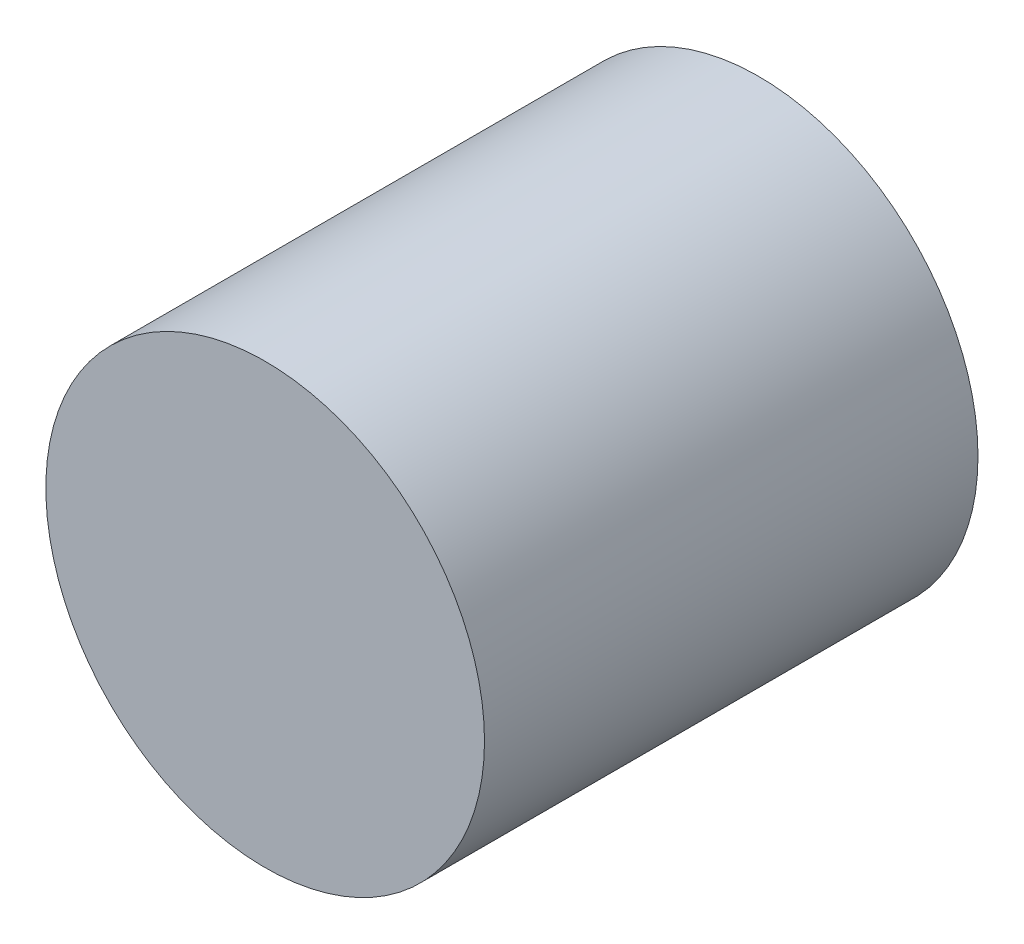
ISO-10303-21;
HEADER;
FILE_DESCRIPTION(('STEP AP214'),'2;1');
FILE_NAME('part.step','',(''),(''),'','','');
FILE_SCHEMA(('AUTOMOTIVE_DESIGN { 1 0 10303 214 1 1 1 1 }'));
ENDSEC;
DATA;
#1=APPLICATION_CONTEXT('core data for automotive mechanical design processes');
#2=APPLICATION_PROTOCOL_DEFINITION('international standard','automotive_design',2000,#1);
#3=PRODUCT_CONTEXT('',#1,'mechanical');
#4=PRODUCT('Part','Part','',(#3));
#5=PRODUCT_RELATED_PRODUCT_CATEGORY('part','',(#4));
#6=PRODUCT_DEFINITION_FORMATION('','',#4);
#7=PRODUCT_DEFINITION_CONTEXT('part definition',#1,'design');
#8=PRODUCT_DEFINITION('design','',#6,#7);
#9=PRODUCT_DEFINITION_SHAPE('','',#8);
#10=(LENGTH_UNIT() NAMED_UNIT(*) SI_UNIT(.MILLI.,.METRE.));
#11=(NAMED_UNIT(*) PLANE_ANGLE_UNIT() SI_UNIT($,.RADIAN.));
#12=(NAMED_UNIT(*) SI_UNIT($,.STERADIAN.) SOLID_ANGLE_UNIT());
#13=UNCERTAINTY_MEASURE_WITH_UNIT(LENGTH_MEASURE(1.E-05),#10,'distance_accuracy_value','');
#14=(GEOMETRIC_REPRESENTATION_CONTEXT(3) GLOBAL_UNCERTAINTY_ASSIGNED_CONTEXT((#13)) GLOBAL_UNIT_ASSIGNED_CONTEXT((#10,
#11,#12)) REPRESENTATION_CONTEXT('',''));
#15=CARTESIAN_POINT('',(0.,0.,0.));
#16=DIRECTION('',(0.,0.,1.));
#17=DIRECTION('',(1.,0.,0.));
#18=AXIS2_PLACEMENT_3D('',#15,#16,#17);
#19=CARTESIAN_POINT('',(0.,0.,4.5));
#20=DIRECTION('',(0.,0.,-1.));
#21=DIRECTION('',(-1.,0.,0.));
#22=AXIS2_PLACEMENT_3D('',#19,#20,#21);
#23=CYLINDRICAL_SURFACE('',#22,2.);
#24=CARTESIAN_POINT('',(0.,0.,4.5));
#25=DIRECTION('',(0.,0.,1.));
#26=DIRECTION('',(1.,0.,0.));
#27=AXIS2_PLACEMENT_3D('',#24,#25,#26);
#28=CIRCLE('',#27,2.);
#29=CARTESIAN_POINT('',(2.,0.,4.5));
#30=VERTEX_POINT('',#29);
#31=EDGE_CURVE('E10',#30,#30,#28,.T.);
#32=ORIENTED_EDGE('',*,*,#31,.F.);
#33=EDGE_LOOP('',(#32));
#34=FACE_BOUND('',#33,.T.);
#35=CARTESIAN_POINT('',(0.,0.,0.));
#36=DIRECTION('',(0.,0.,1.));
#37=DIRECTION('',(1.,0.,0.));
#38=AXIS2_PLACEMENT_3D('',#35,#36,#37);
#39=CIRCLE('',#38,2.);
#40=CARTESIAN_POINT('',(2.,0.,0.));
#41=VERTEX_POINT('',#40);
#42=EDGE_CURVE('E34',#41,#41,#39,.T.);
#43=ORIENTED_EDGE('',*,*,#42,.T.);
#44=EDGE_LOOP('',(#43));
#45=FACE_BOUND('',#44,.T.);
#46=ADVANCED_FACE('F31',(#34,#45),#23,.T.);
#47=CARTESIAN_POINT('',(0.,0.,4.5));
#48=DIRECTION('',(0.,0.,1.));
#49=DIRECTION('',(1.,0.,0.));
#50=AXIS2_PLACEMENT_3D('',#47,#48,#49);
#51=PLANE('',#50);
#52=ORIENTED_EDGE('',*,*,#31,.T.);
#53=EDGE_LOOP('',(#52));
#54=FACE_BOUND('',#53,.T.);
#55=ADVANCED_FACE('F46',(#54),#51,.T.);
#56=CARTESIAN_POINT('',(0.,0.,0.));
#57=DIRECTION('',(0.,0.,1.));
#58=DIRECTION('',(1.,0.,0.));
#59=AXIS2_PLACEMENT_3D('',#56,#57,#58);
#60=PLANE('',#59);
#61=ORIENTED_EDGE('',*,*,#42,.F.);
#62=EDGE_LOOP('',(#61));
#63=FACE_BOUND('',#62,.T.);
#64=ADVANCED_FACE('F44',(#63),#60,.F.);
#65=CLOSED_SHELL('',(#46,#55,#64));
#66=MANIFOLD_SOLID_BREP('B2',#65);
#67=ADVANCED_BREP_SHAPE_REPRESENTATION('',(#18,#66),#14);
#68=SHAPE_DEFINITION_REPRESENTATION(#9,#67);
ENDSEC;
END-ISO-10303-21;
